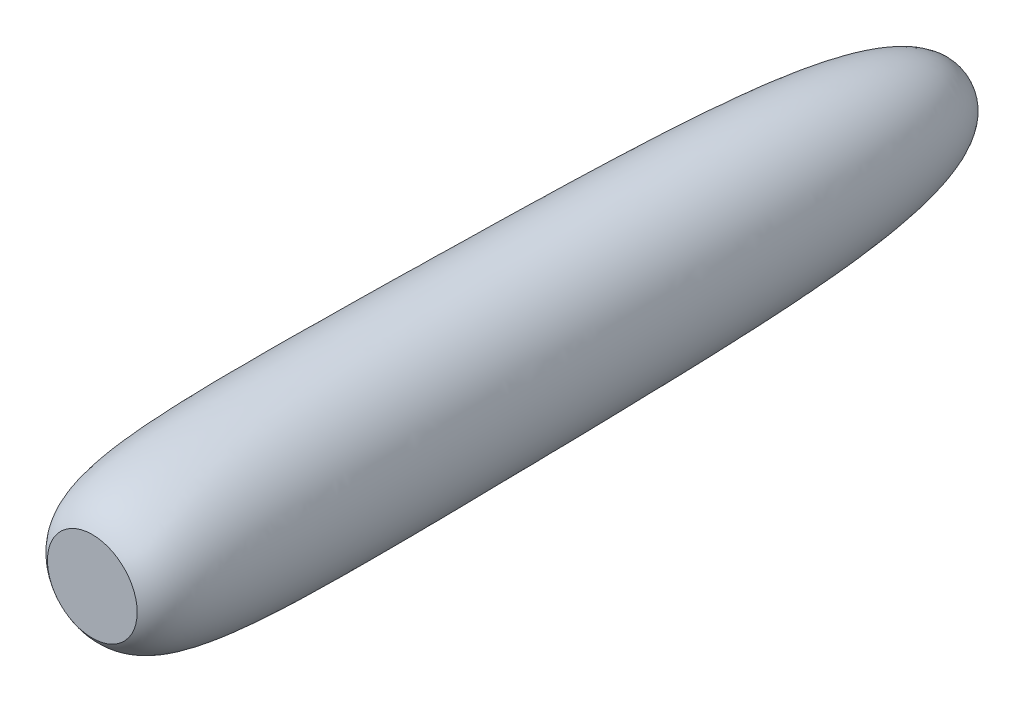
ISO-10303-21;
HEADER;
FILE_DESCRIPTION(('STEP AP214'),'2;1');
FILE_NAME('part.step','',(''),(''),'','','');
FILE_SCHEMA(('AUTOMOTIVE_DESIGN { 1 0 10303 214 1 1 1 1 }'));
ENDSEC;
DATA;
#1=APPLICATION_CONTEXT('core data for automotive mechanical design processes');
#2=APPLICATION_PROTOCOL_DEFINITION('international standard','automotive_design',2000,#1);
#3=PRODUCT_CONTEXT('',#1,'mechanical');
#4=PRODUCT('Part','Part','',(#3));
#5=PRODUCT_RELATED_PRODUCT_CATEGORY('part','',(#4));
#6=PRODUCT_DEFINITION_FORMATION('','',#4);
#7=PRODUCT_DEFINITION_CONTEXT('part definition',#1,'design');
#8=PRODUCT_DEFINITION('design','',#6,#7);
#9=PRODUCT_DEFINITION_SHAPE('','',#8);
#10=(LENGTH_UNIT() NAMED_UNIT(*) SI_UNIT(.MILLI.,.METRE.));
#11=(NAMED_UNIT(*) PLANE_ANGLE_UNIT() SI_UNIT($,.RADIAN.));
#12=(NAMED_UNIT(*) SI_UNIT($,.STERADIAN.) SOLID_ANGLE_UNIT());
#13=UNCERTAINTY_MEASURE_WITH_UNIT(LENGTH_MEASURE(1.E-05),#10,'distance_accuracy_value','');
#14=(GEOMETRIC_REPRESENTATION_CONTEXT(3) GLOBAL_UNCERTAINTY_ASSIGNED_CONTEXT((#13)) GLOBAL_UNIT_ASSIGNED_CONTEXT((#10,
#11,#12)) REPRESENTATION_CONTEXT('',''));
#15=CARTESIAN_POINT('',(0.,0.,0.));
#16=DIRECTION('',(0.,0.,1.));
#17=DIRECTION('',(1.,0.,0.));
#18=AXIS2_PLACEMENT_3D('',#15,#16,#17);
#19=CARTESIAN_POINT('',(0.,0.,551.36796));
#20=CARTESIAN_POINT('',(0.,117.670986520202,536.111793101873));
#21=CARTESIAN_POINT('',(0.,153.234656104035,529.993312313256));
#22=CARTESIAN_POINT('',(0.,30.9707926177724,60.1038890953545));
#23=CARTESIAN_POINT('',(0.,162.2049359697,-462.609002758846));
#24=CARTESIAN_POINT('',(0.,70.7245715233609,-557.778395564196));
#25=CARTESIAN_POINT('',(0.,0.,-551.36796));
#26=B_SPLINE_CURVE_WITH_KNOTS('',6,(#19,#20,#21,#22,#23,#24,#25),.UNSPECIFIED.,.F.,.F.,(7,7),
(0.,1.),.UNSPECIFIED.);
#27=CARTESIAN_POINT('',(0.,0.,551.36796));
#28=DIRECTION('',(0.,0.,1.));
#29=AXIS1_PLACEMENT('',#27,#28);
#30=SURFACE_OF_REVOLUTION('',#26,#29);
#31=CARTESIAN_POINT('',(0.,0.,-551.36796));
#32=VERTEX_POINT('',#31);
#33=VERTEX_LOOP('',#32);
#34=FACE_BOUND('',#33,.T.);
#35=CARTESIAN_POINT('',(0.,0.,536.111793101873));
#36=DIRECTION('',(0.,0.,1.));
#37=DIRECTION('',(1.,0.,0.));
#38=AXIS2_PLACEMENT_3D('',#35,#36,#37);
#39=CIRCLE('',#38,56.3514603995917);
#40=CARTESIAN_POINT('',(56.3514603995917,0.,536.111793101873));
#41=VERTEX_POINT('',#40);
#42=EDGE_CURVE('E11',#41,#41,#39,.T.);
#43=ORIENTED_EDGE('',*,*,#42,.F.);
#44=EDGE_LOOP('',(#43));
#45=FACE_BOUND('',#44,.T.);
#46=ADVANCED_FACE('F49',(#34,#45),#30,.F.);
#47=CARTESIAN_POINT('',(0.,1.05623466056452E-12,536.111793101873));
#48=DIRECTION('',(0.,0.,1.));
#49=DIRECTION('',(1.,0.,0.));
#50=AXIS2_PLACEMENT_3D('',#47,#48,#49);
#51=PLANE('',#50);
#52=ORIENTED_EDGE('',*,*,#42,.T.);
#53=EDGE_LOOP('',(#52));
#54=FACE_BOUND('',#53,.T.);
#55=ADVANCED_FACE('F60',(#54),#51,.T.);
#56=CLOSED_SHELL('',(#46,#55));
#57=MANIFOLD_SOLID_BREP('B2',#56);
#58=ADVANCED_BREP_SHAPE_REPRESENTATION('',(#18,#57),#14);
#59=SHAPE_DEFINITION_REPRESENTATION(#9,#58);
ENDSEC;
END-ISO-10303-21;
